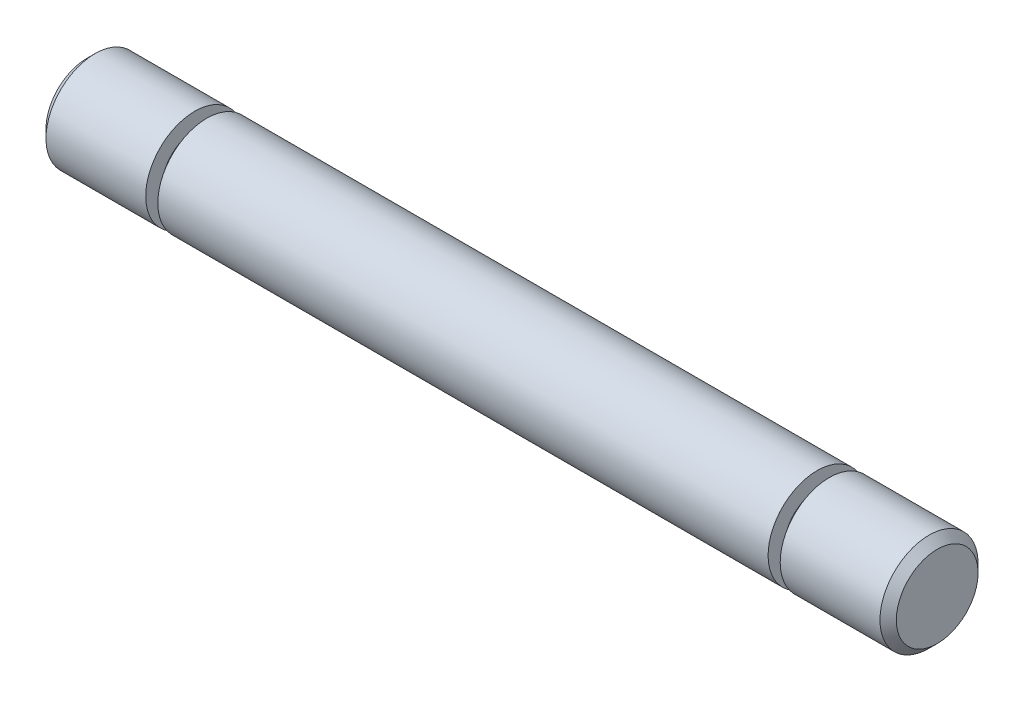
ISO-10303-21;
HEADER;
FILE_DESCRIPTION(('STEP AP214'),'2;1');
FILE_NAME('part.step','',(''),(''),'','','');
FILE_SCHEMA(('AUTOMOTIVE_DESIGN { 1 0 10303 214 1 1 1 1 }'));
ENDSEC;
DATA;
#1=APPLICATION_CONTEXT('core data for automotive mechanical design processes');
#2=APPLICATION_PROTOCOL_DEFINITION('international standard','automotive_design',2000,#1);
#3=PRODUCT_CONTEXT('',#1,'mechanical');
#4=PRODUCT('Part','Part','',(#3));
#5=PRODUCT_RELATED_PRODUCT_CATEGORY('part','',(#4));
#6=PRODUCT_DEFINITION_FORMATION('','',#4);
#7=PRODUCT_DEFINITION_CONTEXT('part definition',#1,'design');
#8=PRODUCT_DEFINITION('design','',#6,#7);
#9=PRODUCT_DEFINITION_SHAPE('','',#8);
#10=(LENGTH_UNIT() NAMED_UNIT(*) SI_UNIT(.MILLI.,.METRE.));
#11=(NAMED_UNIT(*) PLANE_ANGLE_UNIT() SI_UNIT($,.RADIAN.));
#12=(NAMED_UNIT(*) SI_UNIT($,.STERADIAN.) SOLID_ANGLE_UNIT());
#13=UNCERTAINTY_MEASURE_WITH_UNIT(LENGTH_MEASURE(1.E-05),#10,'distance_accuracy_value','');
#14=(GEOMETRIC_REPRESENTATION_CONTEXT(3) GLOBAL_UNCERTAINTY_ASSIGNED_CONTEXT((#13)) GLOBAL_UNIT_ASSIGNED_CONTEXT((#10,
#11,#12)) REPRESENTATION_CONTEXT('',''));
#15=CARTESIAN_POINT('',(0.,0.,0.));
#16=DIRECTION('',(0.,0.,1.));
#17=DIRECTION('',(1.,0.,0.));
#18=AXIS2_PLACEMENT_3D('',#15,#16,#17);
#19=CARTESIAN_POINT('',(0.,0.,0.));
#20=DIRECTION('',(-1.,0.,0.));
#21=DIRECTION('',(0.,0.,1.));
#22=AXIS2_PLACEMENT_3D('',#19,#20,#21);
#23=CYLINDRICAL_SURFACE('',#22,3.);
#24=CARTESIAN_POINT('',(18.66,0.,0.));
#25=DIRECTION('',(1.,0.,0.));
#26=DIRECTION('',(0.,1.,0.));
#27=AXIS2_PLACEMENT_3D('',#24,#25,#26);
#28=CIRCLE('',#27,3.);
#29=CARTESIAN_POINT('',(18.66,3.,0.));
#30=VERTEX_POINT('',#29);
#31=EDGE_CURVE('E63',#30,#30,#28,.T.);
#32=ORIENTED_EDGE('',*,*,#31,.F.);
#33=EDGE_LOOP('',(#32));
#34=FACE_BOUND('',#33,.T.);
#35=CARTESIAN_POINT('',(-18.66,0.,0.));
#36=DIRECTION('',(1.,0.,0.));
#37=DIRECTION('',(0.,1.,0.));
#38=AXIS2_PLACEMENT_3D('',#35,#36,#37);
#39=CIRCLE('',#38,3.);
#40=CARTESIAN_POINT('',(-18.66,3.,0.));
#41=VERTEX_POINT('',#40);
#42=EDGE_CURVE('E57',#41,#41,#39,.T.);
#43=ORIENTED_EDGE('',*,*,#42,.T.);
#44=EDGE_LOOP('',(#43));
#45=FACE_BOUND('',#44,.T.);
#46=ADVANCED_FACE('F31',(#34,#45),#23,.T.);
#47=CARTESIAN_POINT('',(-19.4,0.,0.));
#48=DIRECTION('',(1.,0.,0.));
#49=DIRECTION('',(0.,1.,0.));
#50=AXIS2_PLACEMENT_3D('',#47,#48,#49);
#51=CIRCLE('',#50,3.);
#52=CARTESIAN_POINT('',(-19.4,3.,0.));
#53=VERTEX_POINT('',#52);
#54=EDGE_CURVE('E60',#53,#53,#51,.T.);
#55=ORIENTED_EDGE('',*,*,#54,.F.);
#56=EDGE_LOOP('',(#55));
#57=FACE_BOUND('',#56,.T.);
#58=CARTESIAN_POINT('',(-25.5,0.,0.));
#59=DIRECTION('',(1.,0.,0.));
#60=DIRECTION('',(0.,0.,-1.));
#61=AXIS2_PLACEMENT_3D('',#58,#59,#60);
#62=CIRCLE('',#61,3.);
#63=CARTESIAN_POINT('',(-25.5,0.,-3.));
#64=VERTEX_POINT('',#63);
#65=EDGE_CURVE('E38',#64,#64,#62,.T.);
#66=ORIENTED_EDGE('',*,*,#65,.T.);
#67=EDGE_LOOP('',(#66));
#68=FACE_BOUND('',#67,.T.);
#69=ADVANCED_FACE('F101',(#57,#68),#23,.T.);
#70=CARTESIAN_POINT('',(-26.,0.,0.));
#71=DIRECTION('',(1.,0.,0.));
#72=DIRECTION('',(0.,0.,-1.));
#73=AXIS2_PLACEMENT_3D('',#70,#71,#72);
#74=PLANE('',#73);
#75=CARTESIAN_POINT('',(-26.,0.,0.));
#76=DIRECTION('',(1.,0.,0.));
#77=DIRECTION('',(0.,0.,-1.));
#78=AXIS2_PLACEMENT_3D('',#75,#76,#77);
#79=CIRCLE('',#78,2.49999999999999);
#80=CARTESIAN_POINT('',(-26.,0.,-2.49999999999999));
#81=VERTEX_POINT('',#80);
#82=EDGE_CURVE('E46',#81,#81,#79,.F.);
#83=ORIENTED_EDGE('',*,*,#82,.T.);
#84=EDGE_LOOP('',(#83));
#85=FACE_BOUND('',#84,.T.);
#86=ADVANCED_FACE('F124',(#85),#74,.F.);
#87=CARTESIAN_POINT('',(-26.,0.,0.));
#88=DIRECTION('',(1.,0.,0.));
#89=DIRECTION('',(0.,0.,-1.));
#90=AXIS2_PLACEMENT_3D('',#87,#88,#89);
#91=CONICAL_SURFACE('',#90,2.49999999999999,0.785398163397446);
#92=ORIENTED_EDGE('',*,*,#65,.F.);
#93=EDGE_LOOP('',(#92));
#94=FACE_BOUND('',#93,.T.);
#95=ORIENTED_EDGE('',*,*,#82,.F.);
#96=EDGE_LOOP('',(#95));
#97=FACE_BOUND('',#96,.T.);
#98=ADVANCED_FACE('F119',(#94,#97),#91,.T.);
#99=CARTESIAN_POINT('',(-19.4,3.,0.));
#100=DIRECTION('',(-1.,0.,0.));
#101=DIRECTION('',(0.,-1.,0.));
#102=AXIS2_PLACEMENT_3D('',#99,#100,#101);
#103=PLANE('',#102);
#104=CARTESIAN_POINT('',(-19.4,0.,0.));
#105=DIRECTION('',(1.,0.,0.));
#106=DIRECTION('',(0.,1.,0.));
#107=AXIS2_PLACEMENT_3D('',#104,#105,#106);
#108=CIRCLE('',#107,2.);
#109=CARTESIAN_POINT('',(-19.4,2.,0.));
#110=VERTEX_POINT('',#109);
#111=EDGE_CURVE('E51',#110,#110,#108,.T.);
#112=ORIENTED_EDGE('',*,*,#111,.F.);
#113=EDGE_LOOP('',(#112));
#114=FACE_BOUND('',#113,.T.);
#115=ORIENTED_EDGE('',*,*,#54,.T.);
#116=EDGE_LOOP('',(#115));
#117=FACE_BOUND('',#116,.T.);
#118=ADVANCED_FACE('F113',(#114,#117),#103,.F.);
#119=CARTESIAN_POINT('',(0.,0.,0.));
#120=DIRECTION('',(1.,0.,0.));
#121=DIRECTION('',(0.,1.,0.));
#122=AXIS2_PLACEMENT_3D('',#119,#120,#121);
#123=CYLINDRICAL_SURFACE('',#122,2.);
#124=CARTESIAN_POINT('',(-18.66,0.,0.));
#125=DIRECTION('',(1.,0.,0.));
#126=DIRECTION('',(0.,1.,0.));
#127=AXIS2_PLACEMENT_3D('',#124,#125,#126);
#128=CIRCLE('',#127,2.);
#129=CARTESIAN_POINT('',(-18.66,2.,0.));
#130=VERTEX_POINT('',#129);
#131=EDGE_CURVE('E54',#130,#130,#128,.T.);
#132=ORIENTED_EDGE('',*,*,#131,.F.);
#133=EDGE_LOOP('',(#132));
#134=FACE_BOUND('',#133,.T.);
#135=ORIENTED_EDGE('',*,*,#111,.T.);
#136=EDGE_LOOP('',(#135));
#137=FACE_BOUND('',#136,.T.);
#138=ADVANCED_FACE('F107',(#134,#137),#123,.T.);
#139=CARTESIAN_POINT('',(-18.66,3.,0.));
#140=DIRECTION('',(1.,0.,0.));
#141=DIRECTION('',(0.,1.,0.));
#142=AXIS2_PLACEMENT_3D('',#139,#140,#141);
#143=PLANE('',#142);
#144=ORIENTED_EDGE('',*,*,#42,.F.);
#145=EDGE_LOOP('',(#144));
#146=FACE_BOUND('',#145,.T.);
#147=ORIENTED_EDGE('',*,*,#131,.T.);
#148=EDGE_LOOP('',(#147));
#149=FACE_BOUND('',#148,.T.);
#150=ADVANCED_FACE('F95',(#146,#149),#143,.F.);
#151=CARTESIAN_POINT('',(18.66,3.,0.));
#152=DIRECTION('',(-1.,0.,0.));
#153=DIRECTION('',(0.,-1.,0.));
#154=AXIS2_PLACEMENT_3D('',#151,#152,#153);
#155=PLANE('',#154);
#156=CARTESIAN_POINT('',(18.66,0.,0.));
#157=DIRECTION('',(1.,0.,0.));
#158=DIRECTION('',(0.,1.,0.));
#159=AXIS2_PLACEMENT_3D('',#156,#157,#158);
#160=CIRCLE('',#159,2.);
#161=CARTESIAN_POINT('',(18.66,2.,0.));
#162=VERTEX_POINT('',#161);
#163=EDGE_CURVE('E66',#162,#162,#160,.T.);
#164=ORIENTED_EDGE('',*,*,#163,.F.);
#165=EDGE_LOOP('',(#164));
#166=FACE_BOUND('',#165,.T.);
#167=ORIENTED_EDGE('',*,*,#31,.T.);
#168=EDGE_LOOP('',(#167));
#169=FACE_BOUND('',#168,.T.);
#170=ADVANCED_FACE('F89',(#166,#169),#155,.F.);
#171=CARTESIAN_POINT('',(0.,0.,0.));
#172=DIRECTION('',(1.,0.,0.));
#173=DIRECTION('',(0.,1.,0.));
#174=AXIS2_PLACEMENT_3D('',#171,#172,#173);
#175=CYLINDRICAL_SURFACE('',#174,2.);
#176=CARTESIAN_POINT('',(19.4,0.,0.));
#177=DIRECTION('',(1.,0.,0.));
#178=DIRECTION('',(0.,1.,0.));
#179=AXIS2_PLACEMENT_3D('',#176,#177,#178);
#180=CIRCLE('',#179,2.);
#181=CARTESIAN_POINT('',(19.4,2.,0.));
#182=VERTEX_POINT('',#181);
#183=EDGE_CURVE('E69',#182,#182,#180,.T.);
#184=ORIENTED_EDGE('',*,*,#183,.F.);
#185=EDGE_LOOP('',(#184));
#186=FACE_BOUND('',#185,.T.);
#187=ORIENTED_EDGE('',*,*,#163,.T.);
#188=EDGE_LOOP('',(#187));
#189=FACE_BOUND('',#188,.T.);
#190=ADVANCED_FACE('F83',(#186,#189),#175,.T.);
#191=CARTESIAN_POINT('',(19.4,3.,0.));
#192=DIRECTION('',(1.,0.,0.));
#193=DIRECTION('',(0.,1.,0.));
#194=AXIS2_PLACEMENT_3D('',#191,#192,#193);
#195=PLANE('',#194);
#196=CARTESIAN_POINT('',(19.4,0.,0.));
#197=DIRECTION('',(1.,0.,0.));
#198=DIRECTION('',(0.,1.,0.));
#199=AXIS2_PLACEMENT_3D('',#196,#197,#198);
#200=CIRCLE('',#199,3.);
#201=CARTESIAN_POINT('',(19.4,3.,0.));
#202=VERTEX_POINT('',#201);
#203=EDGE_CURVE('E72',#202,#202,#200,.T.);
#204=ORIENTED_EDGE('',*,*,#203,.F.);
#205=EDGE_LOOP('',(#204));
#206=FACE_BOUND('',#205,.T.);
#207=ORIENTED_EDGE('',*,*,#183,.T.);
#208=EDGE_LOOP('',(#207));
#209=FACE_BOUND('',#208,.T.);
#210=ADVANCED_FACE('F79',(#206,#209),#195,.F.);
#211=CARTESIAN_POINT('',(26.,0.,0.));
#212=DIRECTION('',(-1.,0.,0.));
#213=DIRECTION('',(0.,0.,1.));
#214=AXIS2_PLACEMENT_3D('',#211,#212,#213);
#215=PLANE('',#214);
#216=CARTESIAN_POINT('',(26.,0.,0.));
#217=DIRECTION('',(-1.,0.,0.));
#218=DIRECTION('',(0.,0.,1.));
#219=AXIS2_PLACEMENT_3D('',#216,#217,#218);
#220=CIRCLE('',#219,2.50000000000002);
#221=CARTESIAN_POINT('',(26.,0.,2.50000000000002));
#222=VERTEX_POINT('',#221);
#223=EDGE_CURVE('E10',#222,#222,#220,.F.);
#224=ORIENTED_EDGE('',*,*,#223,.T.);
#225=EDGE_LOOP('',(#224));
#226=FACE_BOUND('',#225,.T.);
#227=ADVANCED_FACE('F82',(#226),#215,.F.);
#228=CARTESIAN_POINT('',(25.5,0.,0.));
#229=DIRECTION('',(-1.,0.,0.));
#230=DIRECTION('',(0.,0.,1.));
#231=AXIS2_PLACEMENT_3D('',#228,#229,#230);
#232=CONICAL_SURFACE('',#231,3.,0.785398163397453);
#233=ORIENTED_EDGE('',*,*,#223,.F.);
#234=EDGE_LOOP('',(#233));
#235=FACE_BOUND('',#234,.T.);
#236=CARTESIAN_POINT('',(25.5,0.,0.));
#237=DIRECTION('',(-1.,0.,0.));
#238=DIRECTION('',(0.,0.,1.));
#239=AXIS2_PLACEMENT_3D('',#236,#237,#238);
#240=CIRCLE('',#239,3.);
#241=CARTESIAN_POINT('',(25.5,0.,3.));
#242=VERTEX_POINT('',#241);
#243=EDGE_CURVE('E42',#242,#242,#240,.T.);
#244=ORIENTED_EDGE('',*,*,#243,.F.);
#245=EDGE_LOOP('',(#244));
#246=FACE_BOUND('',#245,.T.);
#247=ADVANCED_FACE('F33',(#235,#246),#232,.T.);
#248=ORIENTED_EDGE('',*,*,#203,.T.);
#249=EDGE_LOOP('',(#248));
#250=FACE_BOUND('',#249,.T.);
#251=ORIENTED_EDGE('',*,*,#243,.T.);
#252=EDGE_LOOP('',(#251));
#253=FACE_BOUND('',#252,.T.);
#254=ADVANCED_FACE('F76',(#250,#253),#23,.T.);
#255=CLOSED_SHELL('',(#46,#69,#86,#98,#118,#138,#150,#170,#190,#210,#227,#247,#254));
#256=MANIFOLD_SOLID_BREP('B2',#255);
#257=ADVANCED_BREP_SHAPE_REPRESENTATION('',(#18,#256),#14);
#258=SHAPE_DEFINITION_REPRESENTATION(#9,#257);
ENDSEC;
END-ISO-10303-21;
